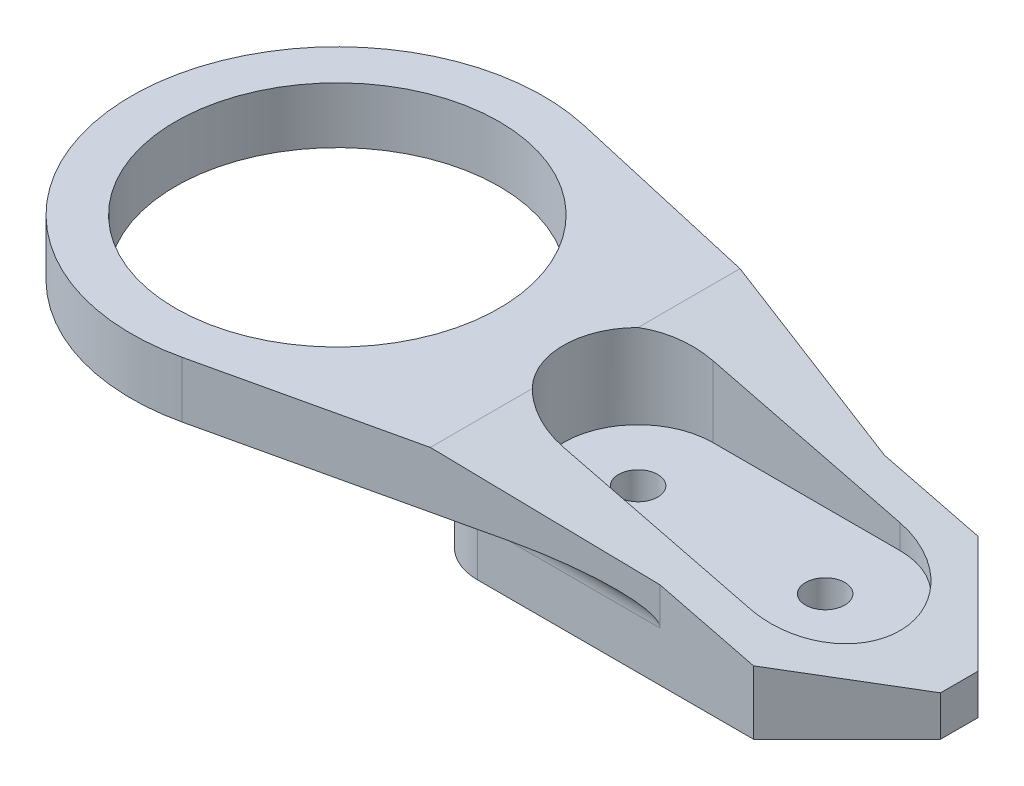
ISO-10303-21;
HEADER;
FILE_DESCRIPTION(('STEP AP214'),'2;1');
FILE_NAME('part.step','',(''),(''),'','','');
FILE_SCHEMA(('AUTOMOTIVE_DESIGN { 1 0 10303 214 1 1 1 1 }'));
ENDSEC;
DATA;
#1=APPLICATION_CONTEXT('core data for automotive mechanical design processes');
#2=APPLICATION_PROTOCOL_DEFINITION('international standard','automotive_design',2000,#1);
#3=PRODUCT_CONTEXT('',#1,'mechanical');
#4=PRODUCT('Part','Part','',(#3));
#5=PRODUCT_RELATED_PRODUCT_CATEGORY('part','',(#4));
#6=PRODUCT_DEFINITION_FORMATION('','',#4);
#7=PRODUCT_DEFINITION_CONTEXT('part definition',#1,'design');
#8=PRODUCT_DEFINITION('design','',#6,#7);
#9=PRODUCT_DEFINITION_SHAPE('','',#8);
#10=(LENGTH_UNIT() NAMED_UNIT(*) SI_UNIT(.MILLI.,.METRE.));
#11=(NAMED_UNIT(*) PLANE_ANGLE_UNIT() SI_UNIT($,.RADIAN.));
#12=(NAMED_UNIT(*) SI_UNIT($,.STERADIAN.) SOLID_ANGLE_UNIT());
#13=UNCERTAINTY_MEASURE_WITH_UNIT(LENGTH_MEASURE(1.E-05),#10,'distance_accuracy_value','');
#14=(GEOMETRIC_REPRESENTATION_CONTEXT(3) GLOBAL_UNCERTAINTY_ASSIGNED_CONTEXT((#13)) GLOBAL_UNIT_ASSIGNED_CONTEXT((#10,
#11,#12)) REPRESENTATION_CONTEXT('',''));
#15=CARTESIAN_POINT('',(0.,0.,0.));
#16=DIRECTION('',(0.,0.,1.));
#17=DIRECTION('',(1.,0.,0.));
#18=AXIS2_PLACEMENT_3D('',#15,#16,#17);
#19=CARTESIAN_POINT('',(17.8298933663439,-2.85,6.));
#20=DIRECTION('',(0.,1.,0.));
#21=DIRECTION('',(0.,0.,1.));
#22=AXIS2_PLACEMENT_3D('',#19,#20,#21);
#23=CYLINDRICAL_SURFACE('',#22,1.05);
#24=CARTESIAN_POINT('',(17.8298933663439,0.,6.));
#25=DIRECTION('',(0.,1.,0.));
#26=DIRECTION('',(-1.,0.,0.));
#27=AXIS2_PLACEMENT_3D('',#24,#25,#26);
#28=CIRCLE('',#27,1.05);
#29=CARTESIAN_POINT('',(16.7798933663439,0.,6.));
#30=VERTEX_POINT('',#29);
#31=EDGE_CURVE('E229',#30,#30,#28,.T.);
#32=ORIENTED_EDGE('',*,*,#31,.F.);
#33=EDGE_LOOP('',(#32));
#34=FACE_BOUND('',#33,.T.);
#35=CARTESIAN_POINT('',(17.8298933663439,2.65,6.));
#36=DIRECTION('',(0.,1.,0.));
#37=DIRECTION('',(0.,0.,1.));
#38=AXIS2_PLACEMENT_3D('',#35,#36,#37);
#39=CIRCLE('',#38,1.05);
#40=CARTESIAN_POINT('',(17.8298933663439,2.65,7.05));
#41=VERTEX_POINT('',#40);
#42=EDGE_CURVE('E226',#41,#41,#39,.F.);
#43=ORIENTED_EDGE('',*,*,#42,.F.);
#44=EDGE_LOOP('',(#43));
#45=FACE_BOUND('',#44,.T.);
#46=ADVANCED_FACE('F41',(#34,#45),#23,.F.);
#47=CARTESIAN_POINT('',(7.82989336634394,-2.85,6.));
#48=DIRECTION('',(0.,1.,0.));
#49=DIRECTION('',(0.,0.,1.));
#50=AXIS2_PLACEMENT_3D('',#47,#48,#49);
#51=CYLINDRICAL_SURFACE('',#50,1.05);
#52=CARTESIAN_POINT('',(7.82989336634394,0.,6.));
#53=DIRECTION('',(0.,1.,0.));
#54=DIRECTION('',(-1.,0.,0.));
#55=AXIS2_PLACEMENT_3D('',#52,#53,#54);
#56=CIRCLE('',#55,1.05);
#57=CARTESIAN_POINT('',(6.77989336634394,0.,6.));
#58=VERTEX_POINT('',#57);
#59=EDGE_CURVE('E232',#58,#58,#56,.T.);
#60=ORIENTED_EDGE('',*,*,#59,.F.);
#61=EDGE_LOOP('',(#60));
#62=FACE_BOUND('',#61,.T.);
#63=CARTESIAN_POINT('',(7.82989336634394,2.65,6.));
#64=DIRECTION('',(0.,1.,0.));
#65=DIRECTION('',(0.,0.,1.));
#66=AXIS2_PLACEMENT_3D('',#63,#64,#65);
#67=CIRCLE('',#66,1.05);
#68=CARTESIAN_POINT('',(7.82989336634394,2.65,7.05));
#69=VERTEX_POINT('',#68);
#70=EDGE_CURVE('E221',#69,#69,#67,.F.);
#71=ORIENTED_EDGE('',*,*,#70,.F.);
#72=EDGE_LOOP('',(#71));
#73=FACE_BOUND('',#72,.T.);
#74=ADVANCED_FACE('F461',(#62,#73),#51,.F.);
#75=CARTESIAN_POINT('',(0.,0.,12.));
#76=DIRECTION('',(0.,0.,-1.));
#77=DIRECTION('',(-1.,0.,0.));
#78=AXIS2_PLACEMENT_3D('',#75,#76,#77);
#79=PLANE('',#78);
#80=DIRECTION('',(0.,1.,0.));
#81=VECTOR('',#80,1.);
#82=CARTESIAN_POINT('',(15.,4.15,12.));
#83=LINE('',#82,#81);
#84=CARTESIAN_POINT('',(15.,2.65,12.));
#85=VERTEX_POINT('',#84);
#86=CARTESIAN_POINT('',(15.,4.64999999999996,12.));
#87=VERTEX_POINT('',#86);
#88=EDGE_CURVE('E261',#85,#87,#83,.T.);
#89=ORIENTED_EDGE('',*,*,#88,.F.);
#90=DIRECTION('',(1.,0.,0.));
#91=VECTOR('',#90,1.);
#92=CARTESIAN_POINT('',(5.25,2.65,12.));
#93=LINE('',#92,#91);
#94=CARTESIAN_POINT('',(5.25,2.65,12.));
#95=VERTEX_POINT('',#94);
#96=EDGE_CURVE('E345',#85,#95,#93,.F.);
#97=ORIENTED_EDGE('',*,*,#96,.T.);
#98=DIRECTION('',(0.,1.,0.));
#99=VECTOR('',#98,1.);
#100=CARTESIAN_POINT('',(5.25,0.,12.));
#101=LINE('',#100,#99);
#102=CARTESIAN_POINT('',(5.25,0.,12.));
#103=VERTEX_POINT('',#102);
#104=EDGE_CURVE('E326',#95,#103,#101,.F.);
#105=ORIENTED_EDGE('',*,*,#104,.T.);
#106=DIRECTION('',(1.,0.,0.));
#107=VECTOR('',#106,1.);
#108=CARTESIAN_POINT('',(25.,0.,12.));
#109=LINE('',#108,#107);
#110=CARTESIAN_POINT('',(20.,0.,12.));
#111=VERTEX_POINT('',#110);
#112=EDGE_CURVE('E269',#103,#111,#109,.T.);
#113=ORIENTED_EDGE('',*,*,#112,.T.);
#114=DIRECTION('',(0.,1.,0.));
#115=VECTOR('',#114,1.);
#116=CARTESIAN_POINT('',(20.,0.,12.));
#117=LINE('',#116,#115);
#118=CARTESIAN_POINT('',(20.,3.39999999999998,12.));
#119=VERTEX_POINT('',#118);
#120=EDGE_CURVE('E291',#111,#119,#117,.T.);
#121=ORIENTED_EDGE('',*,*,#120,.T.);
#122=DIRECTION('',(0.970142500145333,-0.24253562503633,0.));
#123=VECTOR('',#122,1.);
#124=CARTESIAN_POINT('',(4.99999999999971,7.15,12.));
#125=LINE('',#124,#123);
#126=EDGE_CURVE('E287',#119,#87,#125,.F.);
#127=ORIENTED_EDGE('',*,*,#126,.T.);
#128=EDGE_LOOP('',(#89,#97,#105,#113,#121,#127));
#129=FACE_BOUND('',#128,.T.);
#130=ADVANCED_FACE('F442',(#129),#79,.F.);
#131=CARTESIAN_POINT('',(25.,0.,12.));
#132=DIRECTION('',(0.,1.,0.));
#133=DIRECTION('',(-1.,0.,0.));
#134=AXIS2_PLACEMENT_3D('',#131,#132,#133);
#135=PLANE('',#134);
#136=ORIENTED_EDGE('',*,*,#59,.T.);
#137=EDGE_LOOP('',(#136));
#138=FACE_BOUND('',#137,.T.);
#139=ORIENTED_EDGE('',*,*,#31,.T.);
#140=EDGE_LOOP('',(#139));
#141=FACE_BOUND('',#140,.T.);
#142=ORIENTED_EDGE('',*,*,#112,.F.);
#143=CARTESIAN_POINT('',(5.25,0.,9.));
#144=DIRECTION('',(0.,1.,0.));
#145=DIRECTION('',(-1.,0.,0.));
#146=AXIS2_PLACEMENT_3D('',#143,#144,#145);
#147=CIRCLE('',#146,3.);
#148=CARTESIAN_POINT('',(2.25,0.,9.));
#149=VERTEX_POINT('',#148);
#150=EDGE_CURVE('E330',#103,#149,#147,.F.);
#151=ORIENTED_EDGE('',*,*,#150,.T.);
#152=DIRECTION('',(0.,0.,1.));
#153=VECTOR('',#152,1.);
#154=CARTESIAN_POINT('',(2.25,0.,12.));
#155=LINE('',#154,#153);
#156=CARTESIAN_POINT('',(2.25,0.,3.));
#157=VERTEX_POINT('',#156);
#158=EDGE_CURVE('E241',#157,#149,#155,.T.);
#159=ORIENTED_EDGE('',*,*,#158,.F.);
#160=CARTESIAN_POINT('',(5.25,0.,3.));
#161=DIRECTION('',(0.,1.,0.));
#162=DIRECTION('',(-1.,0.,0.));
#163=AXIS2_PLACEMENT_3D('',#160,#161,#162);
#164=CIRCLE('',#163,3.);
#165=CARTESIAN_POINT('',(5.25,0.,0.));
#166=VERTEX_POINT('',#165);
#167=EDGE_CURVE('E328',#157,#166,#164,.F.);
#168=ORIENTED_EDGE('',*,*,#167,.T.);
#169=DIRECTION('',(1.,0.,0.));
#170=VECTOR('',#169,1.);
#171=CARTESIAN_POINT('',(25.,0.,0.));
#172=LINE('',#171,#170);
#173=CARTESIAN_POINT('',(20.,0.,0.));
#174=VERTEX_POINT('',#173);
#175=EDGE_CURVE('E260',#166,#174,#172,.T.);
#176=ORIENTED_EDGE('',*,*,#175,.T.);
#177=DIRECTION('',(0.707106781186549,0.,0.707106781186547));
#178=VECTOR('',#177,1.);
#179=CARTESIAN_POINT('',(25.,0.,5.00000000000001));
#180=LINE('',#179,#178);
#181=CARTESIAN_POINT('',(25.,0.,5.00000000000001));
#182=VERTEX_POINT('',#181);
#183=EDGE_CURVE('E303',#174,#182,#180,.T.);
#184=ORIENTED_EDGE('',*,*,#183,.T.);
#185=DIRECTION('',(0.,0.,-1.));
#186=VECTOR('',#185,1.);
#187=CARTESIAN_POINT('',(25.,0.,12.));
#188=LINE('',#187,#186);
#189=CARTESIAN_POINT('',(25.,0.,6.99999999999997));
#190=VERTEX_POINT('',#189);
#191=EDGE_CURVE('E271',#190,#182,#188,.T.);
#192=ORIENTED_EDGE('',*,*,#191,.F.);
#193=DIRECTION('',(0.707106781186547,0.,-0.707106781186549));
#194=VECTOR('',#193,1.);
#195=CARTESIAN_POINT('',(20.,0.,12.));
#196=LINE('',#195,#194);
#197=EDGE_CURVE('E305',#190,#111,#196,.F.);
#198=ORIENTED_EDGE('',*,*,#197,.T.);
#199=EDGE_LOOP('',(#142,#151,#159,#168,#176,#184,#192,#198));
#200=FACE_BOUND('',#199,.T.);
#201=ADVANCED_FACE('F385',(#138,#141,#200),#135,.F.);
#202=CARTESIAN_POINT('',(0.,0.,0.));
#203=DIRECTION('',(0.,0.,-1.));
#204=DIRECTION('',(-1.,0.,0.));
#205=AXIS2_PLACEMENT_3D('',#202,#203,#204);
#206=PLANE('',#205);
#207=DIRECTION('',(0.,1.,0.));
#208=VECTOR('',#207,1.);
#209=CARTESIAN_POINT('',(5.25,0.,0.));
#210=LINE('',#209,#208);
#211=CARTESIAN_POINT('',(5.25,2.65,0.));
#212=VERTEX_POINT('',#211);
#213=EDGE_CURVE('E332',#166,#212,#210,.T.);
#214=ORIENTED_EDGE('',*,*,#213,.T.);
#215=DIRECTION('',(-1.,0.,0.));
#216=VECTOR('',#215,1.);
#217=CARTESIAN_POINT('',(0.,2.65,0.));
#218=LINE('',#217,#216);
#219=CARTESIAN_POINT('',(15.,2.65,0.));
#220=VERTEX_POINT('',#219);
#221=EDGE_CURVE('E352',#212,#220,#218,.F.);
#222=ORIENTED_EDGE('',*,*,#221,.T.);
#223=DIRECTION('',(0.,1.,0.));
#224=VECTOR('',#223,1.);
#225=CARTESIAN_POINT('',(15.,4.15,0.));
#226=LINE('',#225,#224);
#227=CARTESIAN_POINT('',(15.,4.64999999999996,0.));
#228=VERTEX_POINT('',#227);
#229=EDGE_CURVE('E57',#220,#228,#226,.T.);
#230=ORIENTED_EDGE('',*,*,#229,.T.);
#231=DIRECTION('',(-0.970142500145333,0.24253562503633,0.));
#232=VECTOR('',#231,1.);
#233=CARTESIAN_POINT('',(1.97647058823525,7.9058823529411,0.));
#234=LINE('',#233,#232);
#235=CARTESIAN_POINT('',(20.,3.39999999999998,0.));
#236=VERTEX_POINT('',#235);
#237=EDGE_CURVE('E281',#228,#236,#234,.F.);
#238=ORIENTED_EDGE('',*,*,#237,.T.);
#239=DIRECTION('',(0.,-1.,0.));
#240=VECTOR('',#239,1.);
#241=CARTESIAN_POINT('',(20.,0.,0.));
#242=LINE('',#241,#240);
#243=EDGE_CURVE('E308',#236,#174,#242,.T.);
#244=ORIENTED_EDGE('',*,*,#243,.T.);
#245=ORIENTED_EDGE('',*,*,#175,.F.);
#246=EDGE_LOOP('',(#214,#222,#230,#238,#244,#245));
#247=FACE_BOUND('',#246,.T.);
#248=ADVANCED_FACE('F377',(#247),#206,.T.);
#249=CARTESIAN_POINT('',(25.,7.15,12.));
#250=DIRECTION('',(-1.,0.,0.));
#251=DIRECTION('',(0.,0.,1.));
#252=AXIS2_PLACEMENT_3D('',#249,#250,#251);
#253=PLANE('',#252);
#254=DIRECTION('',(0.,0.,1.));
#255=VECTOR('',#254,1.);
#256=CARTESIAN_POINT('',(25.,2.14999999999999,12.));
#257=LINE('',#256,#255);
#258=CARTESIAN_POINT('',(25.,2.14999999999999,5.00000000000001));
#259=VERTEX_POINT('',#258);
#260=CARTESIAN_POINT('',(25.,2.14999999999999,6.99999999999997));
#261=VERTEX_POINT('',#260);
#262=EDGE_CURVE('E284',#259,#261,#257,.T.);
#263=ORIENTED_EDGE('',*,*,#262,.T.);
#264=DIRECTION('',(0.,-1.,0.));
#265=VECTOR('',#264,1.);
#266=CARTESIAN_POINT('',(25.,7.15,6.99999999999997));
#267=LINE('',#266,#265);
#268=EDGE_CURVE('E301',#261,#190,#267,.T.);
#269=ORIENTED_EDGE('',*,*,#268,.T.);
#270=ORIENTED_EDGE('',*,*,#191,.T.);
#271=DIRECTION('',(0.,1.,0.));
#272=VECTOR('',#271,1.);
#273=CARTESIAN_POINT('',(25.,2.14999999999999,5.00000000000001));
#274=LINE('',#273,#272);
#275=EDGE_CURVE('E298',#182,#259,#274,.T.);
#276=ORIENTED_EDGE('',*,*,#275,.T.);
#277=EDGE_LOOP('',(#263,#269,#270,#276));
#278=FACE_BOUND('',#277,.T.);
#279=ADVANCED_FACE('F436',(#278),#253,.F.);
#280=CARTESIAN_POINT('',(0.,7.15,12.));
#281=DIRECTION('',(0.,-1.,0.));
#282=DIRECTION('',(0.,0.,-1.));
#283=AXIS2_PLACEMENT_3D('',#280,#281,#282);
#284=PLANE('',#283);
#285=CARTESIAN_POINT('',(-8.25,7.15,6.));
#286=DIRECTION('',(0.,-1.,0.));
#287=DIRECTION('',(0.,0.,-1.));
#288=AXIS2_PLACEMENT_3D('',#285,#286,#287);
#289=CIRCLE('',#288,8.65);
#290=CARTESIAN_POINT('',(-8.25,7.15,-2.65));
#291=VERTEX_POINT('',#290);
#292=EDGE_CURVE('E238',#291,#291,#289,.T.);
#293=ORIENTED_EDGE('',*,*,#292,.T.);
#294=EDGE_LOOP('',(#293));
#295=FACE_BOUND('',#294,.T.);
#296=DIRECTION('',(0.,0.,-1.));
#297=VECTOR('',#296,1.);
#298=CARTESIAN_POINT('',(4.99999999999971,7.15,12.));
#299=LINE('',#298,#297);
#300=CARTESIAN_POINT('',(4.99999999999971,7.15,14.2771102196746));
#301=VERTEX_POINT('',#300);
#302=CARTESIAN_POINT('',(4.99999999999971,7.15,8.82696012266195));
#303=VERTEX_POINT('',#302);
#304=EDGE_CURVE('E276',#301,#303,#299,.T.);
#305=ORIENTED_EDGE('',*,*,#304,.T.);
#306=CARTESIAN_POINT('',(7.82989336634394,7.15,6.));
#307=DIRECTION('',(0.,1.,0.));
#308=DIRECTION('',(0.,0.,1.));
#309=AXIS2_PLACEMENT_3D('',#306,#307,#308);
#310=CIRCLE('',#309,4.);
#311=CARTESIAN_POINT('',(4.99999999999971,7.15,3.17303987733804));
#312=VERTEX_POINT('',#311);
#313=EDGE_CURVE('E213',#312,#303,#310,.T.);
#314=ORIENTED_EDGE('',*,*,#313,.F.);
#315=CARTESIAN_POINT('',(4.99999999999971,7.15,-2.27711021967455));
#316=VERTEX_POINT('',#315);
#317=EDGE_CURVE('E275',#312,#316,#299,.T.);
#318=ORIENTED_EDGE('',*,*,#317,.T.);
#319=DIRECTION('',(-0.975040415413256,0.,-0.222027449453318));
#320=VECTOR('',#319,1.);
#321=CARTESIAN_POINT('',(0.739442824661187,7.15,-3.24728604822164));
#322=LINE('',#321,#320);
#323=CARTESIAN_POINT('',(-5.80494920248651,7.15,-4.73751624487906));
#324=VERTEX_POINT('',#323);
#325=EDGE_CURVE('E244',#316,#324,#322,.T.);
#326=ORIENTED_EDGE('',*,*,#325,.T.);
#327=CARTESIAN_POINT('',(-8.25,7.15,6.));
#328=DIRECTION('',(0.,1.,0.));
#329=DIRECTION('',(0.,0.,1.));
#330=AXIS2_PLACEMENT_3D('',#327,#328,#329);
#331=CIRCLE('',#330,11.0123806922692);
#332=CARTESIAN_POINT('',(-5.80494920248651,7.15,16.7375162448791));
#333=VERTEX_POINT('',#332);
#334=EDGE_CURVE('E255',#324,#333,#331,.T.);
#335=ORIENTED_EDGE('',*,*,#334,.T.);
#336=DIRECTION('',(-0.975040415413256,0.,0.222027449453318));
#337=VECTOR('',#336,1.);
#338=CARTESIAN_POINT('',(3.3372716632385,7.15,14.6557317884927));
#339=LINE('',#338,#337);
#340=EDGE_CURVE('E248',#301,#333,#339,.T.);
#341=ORIENTED_EDGE('',*,*,#340,.F.);
#342=EDGE_LOOP('',(#305,#314,#318,#326,#335,#341));
#343=FACE_BOUND('',#342,.T.);
#344=ADVANCED_FACE('F419',(#295,#343),#284,.F.);
#345=CARTESIAN_POINT('',(0.739442824661187,4.15,-3.24728604822164));
#346=DIRECTION('',(0.222027449453318,0.,-0.975040415413256));
#347=DIRECTION('',(-0.975040415413256,0.,-0.222027449453318));
#348=AXIS2_PLACEMENT_3D('',#345,#346,#347);
#349=PLANE('',#348);
#350=ORIENTED_EDGE('',*,*,#325,.F.);
#351=DIRECTION('',(-0.947302626103098,0.236825656525771,-0.215711249102385));
#352=VECTOR('',#351,1.);
#353=CARTESIAN_POINT('',(1.65143880185032,7.98714029953734,-3.0396145122257));
#354=LINE('',#353,#352);
#355=EDGE_CURVE('E279',#316,#228,#354,.F.);
#356=ORIENTED_EDGE('',*,*,#355,.T.);
#357=ORIENTED_EDGE('',*,*,#229,.F.);
#358=CARTESIAN_POINT('',(8.41270357912484,2.65,-1.5));
#359=DIRECTION('',(0.222027449453318,0.,-0.975040415413256));
#360=DIRECTION('',(-0.975040415413256,0.,-0.222027449453318));
#361=AXIS2_PLACEMENT_3D('',#358,#359,#360);
#362=ELLIPSE('',#361,6.75592141284034,1.5);
#363=CARTESIAN_POINT('',(8.41270357912484,4.15,-1.5));
#364=VERTEX_POINT('',#363);
#365=EDGE_CURVE('E11',#220,#364,#362,.F.);
#366=ORIENTED_EDGE('',*,*,#365,.T.);
#367=DIRECTION('',(-0.975040415413256,0.,-0.222027449453318));
#368=VECTOR('',#367,1.);
#369=CARTESIAN_POINT('',(0.739442824661187,4.15,-3.24728604822164));
#370=LINE('',#369,#368);
#371=CARTESIAN_POINT('',(-5.80494920248651,4.15,-4.73751624487906));
#372=VERTEX_POINT('',#371);
#373=EDGE_CURVE('E245',#364,#372,#370,.T.);
#374=ORIENTED_EDGE('',*,*,#373,.T.);
#375=DIRECTION('',(0.,1.,0.));
#376=VECTOR('',#375,1.);
#377=CARTESIAN_POINT('',(-5.80494920248651,4.15,-4.73751624487906));
#378=LINE('',#377,#376);
#379=EDGE_CURVE('E253',#372,#324,#378,.T.);
#380=ORIENTED_EDGE('',*,*,#379,.T.);
#381=EDGE_LOOP('',(#350,#356,#357,#366,#374,#380));
#382=FACE_BOUND('',#381,.T.);
#383=ADVANCED_FACE('F417',(#382),#349,.T.);
#384=CARTESIAN_POINT('',(3.3372716632385,4.15,14.6557317884927));
#385=DIRECTION('',(-0.222027449453318,0.,-0.975040415413256));
#386=DIRECTION('',(-0.975040415413256,0.,0.222027449453318));
#387=AXIS2_PLACEMENT_3D('',#384,#385,#386);
#388=PLANE('',#387);
#389=ORIENTED_EDGE('',*,*,#88,.T.);
#390=DIRECTION('',(0.947302626103098,-0.236825656525771,-0.215711249102385));
#391=VECTOR('',#390,1.);
#392=CARTESIAN_POINT('',(5.46531342989284,7.03367164252672,14.1711532230184));
#393=LINE('',#392,#391);
#394=EDGE_CURVE('E289',#87,#301,#393,.F.);
#395=ORIENTED_EDGE('',*,*,#394,.T.);
#396=ORIENTED_EDGE('',*,*,#340,.T.);
#397=DIRECTION('',(0.,1.,0.));
#398=VECTOR('',#397,1.);
#399=CARTESIAN_POINT('',(-5.80494920248651,4.15,16.7375162448791));
#400=LINE('',#399,#398);
#401=CARTESIAN_POINT('',(-5.80494920248651,4.15,16.7375162448791));
#402=VERTEX_POINT('',#401);
#403=EDGE_CURVE('E264',#402,#333,#400,.T.);
#404=ORIENTED_EDGE('',*,*,#403,.F.);
#405=DIRECTION('',(-0.975040415413256,0.,0.222027449453318));
#406=VECTOR('',#405,1.);
#407=CARTESIAN_POINT('',(3.3372716632385,4.15,14.6557317884927));
#408=LINE('',#407,#406);
#409=CARTESIAN_POINT('',(8.41270357912485,4.15,13.5));
#410=VERTEX_POINT('',#409);
#411=EDGE_CURVE('E251',#410,#402,#408,.T.);
#412=ORIENTED_EDGE('',*,*,#411,.F.);
#413=CARTESIAN_POINT('',(8.41270357912485,2.65,13.5));
#414=DIRECTION('',(-0.222027449453318,0.,-0.975040415413256));
#415=DIRECTION('',(-0.975040415413256,0.,0.222027449453318));
#416=AXIS2_PLACEMENT_3D('',#413,#414,#415);
#417=ELLIPSE('',#416,6.75592141284034,1.5);
#418=EDGE_CURVE('E50',#410,#85,#417,.T.);
#419=ORIENTED_EDGE('',*,*,#418,.T.);
#420=EDGE_LOOP('',(#389,#395,#396,#404,#412,#419));
#421=FACE_BOUND('',#420,.T.);
#422=ADVANCED_FACE('F409',(#421),#388,.F.);
#423=CARTESIAN_POINT('',(-8.25,4.15,6.));
#424=DIRECTION('',(0.,1.,0.));
#425=DIRECTION('',(0.,0.,1.));
#426=AXIS2_PLACEMENT_3D('',#423,#424,#425);
#427=CYLINDRICAL_SURFACE('',#426,11.0123806922692);
#428=ORIENTED_EDGE('',*,*,#334,.F.);
#429=ORIENTED_EDGE('',*,*,#379,.F.);
#430=CARTESIAN_POINT('',(-8.25,4.15,6.));
#431=DIRECTION('',(0.,1.,0.));
#432=DIRECTION('',(0.,0.,1.));
#433=AXIS2_PLACEMENT_3D('',#430,#431,#432);
#434=CIRCLE('',#433,11.0123806922692);
#435=EDGE_CURVE('E247',#372,#402,#434,.T.);
#436=ORIENTED_EDGE('',*,*,#435,.T.);
#437=ORIENTED_EDGE('',*,*,#403,.T.);
#438=EDGE_LOOP('',(#428,#429,#436,#437));
#439=FACE_BOUND('',#438,.T.);
#440=ADVANCED_FACE('F414',(#439),#427,.T.);
#441=CARTESIAN_POINT('',(0.,4.15,0.));
#442=DIRECTION('',(0.,1.,0.));
#443=DIRECTION('',(0.,0.,1.));
#444=AXIS2_PLACEMENT_3D('',#441,#442,#443);
#445=PLANE('',#444);
#446=CARTESIAN_POINT('',(-8.25,4.15,6.));
#447=DIRECTION('',(0.,-1.,0.));
#448=DIRECTION('',(0.,0.,-1.));
#449=AXIS2_PLACEMENT_3D('',#446,#447,#448);
#450=CIRCLE('',#449,8.65);
#451=CARTESIAN_POINT('',(-8.25,4.15,-2.65));
#452=VERTEX_POINT('',#451);
#453=EDGE_CURVE('E235',#452,#452,#450,.T.);
#454=ORIENTED_EDGE('',*,*,#453,.F.);
#455=EDGE_LOOP('',(#454));
#456=FACE_BOUND('',#455,.T.);
#457=CARTESIAN_POINT('',(5.25,4.15,9.));
#458=DIRECTION('',(0.,1.,0.));
#459=DIRECTION('',(0.,0.,1.));
#460=AXIS2_PLACEMENT_3D('',#457,#458,#459);
#461=CIRCLE('',#460,4.5);
#462=CARTESIAN_POINT('',(0.75,4.15,9.));
#463=VERTEX_POINT('',#462);
#464=CARTESIAN_POINT('',(5.25,4.15,13.5));
#465=VERTEX_POINT('',#464);
#466=EDGE_CURVE('E340',#463,#465,#461,.T.);
#467=ORIENTED_EDGE('',*,*,#466,.T.);
#468=DIRECTION('',(1.,0.,0.));
#469=VECTOR('',#468,1.);
#470=CARTESIAN_POINT('',(15.,4.15,13.5));
#471=LINE('',#470,#469);
#472=EDGE_CURVE('E342',#465,#410,#471,.T.);
#473=ORIENTED_EDGE('',*,*,#472,.T.);
#474=ORIENTED_EDGE('',*,*,#411,.T.);
#475=ORIENTED_EDGE('',*,*,#435,.F.);
#476=ORIENTED_EDGE('',*,*,#373,.F.);
#477=DIRECTION('',(-1.,0.,0.));
#478=VECTOR('',#477,1.);
#479=CARTESIAN_POINT('',(0.,4.15,-1.5));
#480=LINE('',#479,#478);
#481=CARTESIAN_POINT('',(5.25,4.15,-1.5));
#482=VERTEX_POINT('',#481);
#483=EDGE_CURVE('E334',#364,#482,#480,.T.);
#484=ORIENTED_EDGE('',*,*,#483,.T.);
#485=CARTESIAN_POINT('',(5.25,4.15,3.));
#486=DIRECTION('',(0.,1.,0.));
#487=DIRECTION('',(0.,0.,1.));
#488=AXIS2_PLACEMENT_3D('',#485,#486,#487);
#489=CIRCLE('',#488,4.5);
#490=CARTESIAN_POINT('',(0.75,4.15,3.));
#491=VERTEX_POINT('',#490);
#492=EDGE_CURVE('E336',#482,#491,#489,.T.);
#493=ORIENTED_EDGE('',*,*,#492,.T.);
#494=DIRECTION('',(0.,0.,1.));
#495=VECTOR('',#494,1.);
#496=CARTESIAN_POINT('',(0.75,4.15,0.));
#497=LINE('',#496,#495);
#498=EDGE_CURVE('E338',#491,#463,#497,.T.);
#499=ORIENTED_EDGE('',*,*,#498,.T.);
#500=EDGE_LOOP('',(#467,#473,#474,#475,#476,#484,#493,#499));
#501=FACE_BOUND('',#500,.T.);
#502=ADVANCED_FACE('F405',(#456,#501),#445,.F.);
#503=CARTESIAN_POINT('',(2.25,-16.85,6.));
#504=DIRECTION('',(-1.,0.,0.));
#505=DIRECTION('',(0.,0.,1.));
#506=AXIS2_PLACEMENT_3D('',#503,#504,#505);
#507=PLANE('',#506);
#508=DIRECTION('',(0.,1.,0.));
#509=VECTOR('',#508,1.);
#510=CARTESIAN_POINT('',(2.25,4.15,9.));
#511=LINE('',#510,#509);
#512=CARTESIAN_POINT('',(2.25,2.65,9.));
#513=VERTEX_POINT('',#512);
#514=EDGE_CURVE('E323',#149,#513,#511,.T.);
#515=ORIENTED_EDGE('',*,*,#514,.T.);
#516=DIRECTION('',(0.,0.,1.));
#517=VECTOR('',#516,1.);
#518=CARTESIAN_POINT('',(2.25,2.65,6.));
#519=LINE('',#518,#517);
#520=CARTESIAN_POINT('',(2.25,2.65,3.));
#521=VERTEX_POINT('',#520);
#522=EDGE_CURVE('E349',#513,#521,#519,.F.);
#523=ORIENTED_EDGE('',*,*,#522,.T.);
#524=DIRECTION('',(0.,1.,0.));
#525=VECTOR('',#524,1.);
#526=CARTESIAN_POINT('',(2.25,-16.85,3.));
#527=LINE('',#526,#525);
#528=EDGE_CURVE('E321',#521,#157,#527,.F.);
#529=ORIENTED_EDGE('',*,*,#528,.T.);
#530=ORIENTED_EDGE('',*,*,#158,.T.);
#531=EDGE_LOOP('',(#515,#523,#529,#530));
#532=FACE_BOUND('',#531,.T.);
#533=ADVANCED_FACE('F389',(#532),#507,.T.);
#534=CARTESIAN_POINT('',(-8.25,14.15,6.));
#535=DIRECTION('',(0.,-1.,0.));
#536=DIRECTION('',(0.,0.,-1.));
#537=AXIS2_PLACEMENT_3D('',#534,#535,#536);
#538=CYLINDRICAL_SURFACE('',#537,8.65);
#539=ORIENTED_EDGE('',*,*,#453,.T.);
#540=EDGE_LOOP('',(#539));
#541=FACE_BOUND('',#540,.T.);
#542=ORIENTED_EDGE('',*,*,#292,.F.);
#543=EDGE_LOOP('',(#542));
#544=FACE_BOUND('',#543,.T.);
#545=ADVANCED_FACE('F472',(#541,#544),#538,.F.);
#546=CARTESIAN_POINT('',(4.99999999999971,7.15,12.));
#547=DIRECTION('',(-0.24253562503633,-0.970142500145333,0.));
#548=DIRECTION('',(0.,0.,-1.));
#549=AXIS2_PLACEMENT_3D('',#546,#547,#548);
#550=PLANE('',#549);
#551=CARTESIAN_POINT('',(7.82989336634394,6.44252665841395,6.));
#552=DIRECTION('',(-0.24253562503633,-0.970142500145333,0.));
#553=DIRECTION('',(-0.970142500145333,0.24253562503633,0.));
#554=AXIS2_PLACEMENT_3D('',#551,#552,#553);
#555=ELLIPSE('',#554,4.12310562561766,4.);
#556=CARTESIAN_POINT('',(7.82989336634394,6.44252665841395,10.));
#557=VERTEX_POINT('',#556);
#558=EDGE_CURVE('E195',#303,#557,#555,.F.);
#559=ORIENTED_EDGE('',*,*,#558,.F.);
#560=ORIENTED_EDGE('',*,*,#304,.F.);
#561=ORIENTED_EDGE('',*,*,#394,.F.);
#562=ORIENTED_EDGE('',*,*,#126,.F.);
#563=DIRECTION('',(0.696310623822791,-0.174077655955695,-0.696310623822793));
#564=VECTOR('',#563,1.);
#565=CARTESIAN_POINT('',(12.2727272727271,5.33181818181817,19.7272727272729));
#566=LINE('',#565,#564);
#567=EDGE_CURVE('E296',#119,#261,#566,.T.);
#568=ORIENTED_EDGE('',*,*,#567,.T.);
#569=ORIENTED_EDGE('',*,*,#262,.F.);
#570=DIRECTION('',(0.696310623822793,-0.174077655955696,0.696310623822791));
#571=VECTOR('',#570,1.);
#572=CARTESIAN_POINT('',(18.0909090909089,3.87727272727274,-1.90909090909105));
#573=LINE('',#572,#571);
#574=EDGE_CURVE('E294',#259,#236,#573,.F.);
#575=ORIENTED_EDGE('',*,*,#574,.T.);
#576=ORIENTED_EDGE('',*,*,#237,.F.);
#577=ORIENTED_EDGE('',*,*,#355,.F.);
#578=ORIENTED_EDGE('',*,*,#317,.F.);
#579=CARTESIAN_POINT('',(7.82989336634394,6.44252665841395,2.));
#580=VERTEX_POINT('',#579);
#581=EDGE_CURVE('E319',#580,#312,#555,.F.);
#582=ORIENTED_EDGE('',*,*,#581,.F.);
#583=DIRECTION('',(0.970142500145333,-0.24253562503633,0.));
#584=VECTOR('',#583,1.);
#585=CARTESIAN_POINT('',(4.99999999999971,7.15,2.));
#586=LINE('',#585,#584);
#587=CARTESIAN_POINT('',(17.8298933663439,3.94252665841398,2.));
#588=VERTEX_POINT('',#587);
#589=EDGE_CURVE('E317',#588,#580,#586,.F.);
#590=ORIENTED_EDGE('',*,*,#589,.F.);
#591=CARTESIAN_POINT('',(17.8298933663439,3.94252665841398,6.));
#592=DIRECTION('',(-0.24253562503633,-0.970142500145333,0.));
#593=DIRECTION('',(-0.970142500145333,0.24253562503633,0.));
#594=AXIS2_PLACEMENT_3D('',#591,#592,#593);
#595=ELLIPSE('',#594,4.12310562561766,4.);
#596=CARTESIAN_POINT('',(17.8298933663439,3.94252665841398,10.));
#597=VERTEX_POINT('',#596);
#598=EDGE_CURVE('E315',#597,#588,#595,.F.);
#599=ORIENTED_EDGE('',*,*,#598,.F.);
#600=DIRECTION('',(-0.970142500145333,0.24253562503633,0.));
#601=VECTOR('',#600,1.);
#602=CARTESIAN_POINT('',(4.99999999999971,7.15,10.));
#603=LINE('',#602,#601);
#604=EDGE_CURVE('E311',#557,#597,#603,.F.);
#605=ORIENTED_EDGE('',*,*,#604,.F.);
#606=EDGE_LOOP('',(#559,#560,#561,#562,#568,#569,#575,#576,#577,#578,#582,#590,#599,#605));
#607=FACE_BOUND('',#606,.T.);
#608=ADVANCED_FACE('F426',(#607),#550,.F.);
#609=CARTESIAN_POINT('',(20.,0.,12.));
#610=DIRECTION('',(-0.707106781186549,0.,-0.707106781186547));
#611=DIRECTION('',(0.,1.,0.));
#612=AXIS2_PLACEMENT_3D('',#609,#610,#611);
#613=PLANE('',#612);
#614=ORIENTED_EDGE('',*,*,#197,.F.);
#615=ORIENTED_EDGE('',*,*,#268,.F.);
#616=ORIENTED_EDGE('',*,*,#567,.F.);
#617=ORIENTED_EDGE('',*,*,#120,.F.);
#618=EDGE_LOOP('',(#614,#615,#616,#617));
#619=FACE_BOUND('',#618,.T.);
#620=ADVANCED_FACE('F439',(#619),#613,.F.);
#621=CARTESIAN_POINT('',(25.,7.15,5.00000000000001));
#622=DIRECTION('',(0.707106781186547,0.,-0.707106781186549));
#623=DIRECTION('',(0.,-1.,0.));
#624=AXIS2_PLACEMENT_3D('',#621,#622,#623);
#625=PLANE('',#624);
#626=ORIENTED_EDGE('',*,*,#183,.F.);
#627=ORIENTED_EDGE('',*,*,#243,.F.);
#628=ORIENTED_EDGE('',*,*,#574,.F.);
#629=ORIENTED_EDGE('',*,*,#275,.F.);
#630=EDGE_LOOP('',(#626,#627,#628,#629));
#631=FACE_BOUND('',#630,.T.);
#632=ADVANCED_FACE('F431',(#631),#625,.T.);
#633=CARTESIAN_POINT('',(7.82989336634394,2.65,6.));
#634=DIRECTION('',(0.,1.,0.));
#635=DIRECTION('',(0.,0.,1.));
#636=AXIS2_PLACEMENT_3D('',#633,#634,#635);
#637=PLANE('',#636);
#638=CARTESIAN_POINT('',(7.82989336634394,2.65,6.));
#639=DIRECTION('',(0.,1.,0.));
#640=DIRECTION('',(0.,0.,1.));
#641=AXIS2_PLACEMENT_3D('',#638,#639,#640);
#642=CIRCLE('',#641,4.);
#643=CARTESIAN_POINT('',(7.82989336634394,2.65,2.));
#644=VERTEX_POINT('',#643);
#645=CARTESIAN_POINT('',(7.82989336634394,2.65,10.));
#646=VERTEX_POINT('',#645);
#647=EDGE_CURVE('E192',#644,#646,#642,.T.);
#648=ORIENTED_EDGE('',*,*,#647,.T.);
#649=DIRECTION('',(1.,0.,0.));
#650=VECTOR('',#649,1.);
#651=CARTESIAN_POINT('',(17.8298933663439,2.65,10.));
#652=LINE('',#651,#650);
#653=CARTESIAN_POINT('',(17.8298933663439,2.65,10.));
#654=VERTEX_POINT('',#653);
#655=EDGE_CURVE('E202',#646,#654,#652,.T.);
#656=ORIENTED_EDGE('',*,*,#655,.T.);
#657=CARTESIAN_POINT('',(17.8298933663439,2.65,6.));
#658=DIRECTION('',(0.,1.,0.));
#659=DIRECTION('',(0.,0.,1.));
#660=AXIS2_PLACEMENT_3D('',#657,#658,#659);
#661=CIRCLE('',#660,4.);
#662=CARTESIAN_POINT('',(17.8298933663439,2.65,2.));
#663=VERTEX_POINT('',#662);
#664=EDGE_CURVE('E208',#654,#663,#661,.T.);
#665=ORIENTED_EDGE('',*,*,#664,.T.);
#666=DIRECTION('',(-1.,0.,0.));
#667=VECTOR('',#666,1.);
#668=CARTESIAN_POINT('',(7.82989336634394,2.65,2.));
#669=LINE('',#668,#667);
#670=EDGE_CURVE('E199',#663,#644,#669,.T.);
#671=ORIENTED_EDGE('',*,*,#670,.T.);
#672=EDGE_LOOP('',(#648,#656,#665,#671));
#673=FACE_BOUND('',#672,.T.);
#674=ORIENTED_EDGE('',*,*,#70,.T.);
#675=EDGE_LOOP('',(#674));
#676=FACE_BOUND('',#675,.T.);
#677=ORIENTED_EDGE('',*,*,#42,.T.);
#678=EDGE_LOOP('',(#677));
#679=FACE_BOUND('',#678,.T.);
#680=ADVANCED_FACE('F210',(#673,#676,#679),#637,.T.);
#681=CARTESIAN_POINT('',(7.82989336634394,2.65,6.));
#682=DIRECTION('',(0.,1.,0.));
#683=DIRECTION('',(0.,0.,1.));
#684=AXIS2_PLACEMENT_3D('',#681,#682,#683);
#685=CYLINDRICAL_SURFACE('',#684,4.);
#686=ORIENTED_EDGE('',*,*,#558,.T.);
#687=DIRECTION('',(0.,1.,0.));
#688=VECTOR('',#687,1.);
#689=CARTESIAN_POINT('',(7.82989336634394,2.65,10.));
#690=LINE('',#689,#688);
#691=EDGE_CURVE('E187',#646,#557,#690,.T.);
#692=ORIENTED_EDGE('',*,*,#691,.F.);
#693=ORIENTED_EDGE('',*,*,#647,.F.);
#694=DIRECTION('',(0.,1.,0.));
#695=VECTOR('',#694,1.);
#696=CARTESIAN_POINT('',(7.82989336634394,2.65,2.));
#697=LINE('',#696,#695);
#698=EDGE_CURVE('E219',#644,#580,#697,.T.);
#699=ORIENTED_EDGE('',*,*,#698,.T.);
#700=ORIENTED_EDGE('',*,*,#581,.T.);
#701=ORIENTED_EDGE('',*,*,#313,.T.);
#702=EDGE_LOOP('',(#686,#692,#693,#699,#700,#701));
#703=FACE_BOUND('',#702,.T.);
#704=ADVANCED_FACE('F189',(#703),#685,.F.);
#705=CARTESIAN_POINT('',(7.82989336634394,2.65,2.));
#706=DIRECTION('',(0.,0.,-1.));
#707=DIRECTION('',(-1.,0.,0.));
#708=AXIS2_PLACEMENT_3D('',#705,#706,#707);
#709=PLANE('',#708);
#710=ORIENTED_EDGE('',*,*,#589,.T.);
#711=ORIENTED_EDGE('',*,*,#698,.F.);
#712=ORIENTED_EDGE('',*,*,#670,.F.);
#713=DIRECTION('',(0.,1.,0.));
#714=VECTOR('',#713,1.);
#715=CARTESIAN_POINT('',(17.8298933663439,2.65,2.));
#716=LINE('',#715,#714);
#717=EDGE_CURVE('E222',#663,#588,#716,.T.);
#718=ORIENTED_EDGE('',*,*,#717,.T.);
#719=EDGE_LOOP('',(#710,#711,#712,#718));
#720=FACE_BOUND('',#719,.T.);
#721=ADVANCED_FACE('F450',(#720),#709,.F.);
#722=CARTESIAN_POINT('',(17.8298933663439,2.65,6.));
#723=DIRECTION('',(0.,1.,0.));
#724=DIRECTION('',(0.,0.,1.));
#725=AXIS2_PLACEMENT_3D('',#722,#723,#724);
#726=CYLINDRICAL_SURFACE('',#725,4.);
#727=ORIENTED_EDGE('',*,*,#598,.T.);
#728=ORIENTED_EDGE('',*,*,#717,.F.);
#729=ORIENTED_EDGE('',*,*,#664,.F.);
#730=DIRECTION('',(0.,1.,0.));
#731=VECTOR('',#730,1.);
#732=CARTESIAN_POINT('',(17.8298933663439,2.65,10.));
#733=LINE('',#732,#731);
#734=EDGE_CURVE('E198',#654,#597,#733,.T.);
#735=ORIENTED_EDGE('',*,*,#734,.T.);
#736=EDGE_LOOP('',(#727,#728,#729,#735));
#737=FACE_BOUND('',#736,.T.);
#738=ADVANCED_FACE('F448',(#737),#726,.F.);
#739=CARTESIAN_POINT('',(17.8298933663439,2.65,10.));
#740=DIRECTION('',(0.,0.,1.));
#741=DIRECTION('',(1.,0.,0.));
#742=AXIS2_PLACEMENT_3D('',#739,#740,#741);
#743=PLANE('',#742);
#744=ORIENTED_EDGE('',*,*,#604,.T.);
#745=ORIENTED_EDGE('',*,*,#734,.F.);
#746=ORIENTED_EDGE('',*,*,#655,.F.);
#747=ORIENTED_EDGE('',*,*,#691,.T.);
#748=EDGE_LOOP('',(#744,#745,#746,#747));
#749=FACE_BOUND('',#748,.T.);
#750=ADVANCED_FACE('F203',(#749),#743,.F.);
#751=CARTESIAN_POINT('',(5.25,-16.85,9.));
#752=DIRECTION('',(0.,-1.,0.));
#753=DIRECTION('',(0.,0.,-1.));
#754=AXIS2_PLACEMENT_3D('',#751,#752,#753);
#755=CYLINDRICAL_SURFACE('',#754,3.);
#756=ORIENTED_EDGE('',*,*,#104,.F.);
#757=CARTESIAN_POINT('',(5.25,2.65,9.));
#758=DIRECTION('',(0.,1.,0.));
#759=DIRECTION('',(0.,0.,1.));
#760=AXIS2_PLACEMENT_3D('',#757,#758,#759);
#761=CIRCLE('',#760,3.);
#762=EDGE_CURVE('E347',#95,#513,#761,.F.);
#763=ORIENTED_EDGE('',*,*,#762,.T.);
#764=ORIENTED_EDGE('',*,*,#514,.F.);
#765=ORIENTED_EDGE('',*,*,#150,.F.);
#766=EDGE_LOOP('',(#756,#763,#764,#765));
#767=FACE_BOUND('',#766,.T.);
#768=ADVANCED_FACE('F392',(#767),#755,.T.);
#769=CARTESIAN_POINT('',(5.25,0.,3.));
#770=DIRECTION('',(0.,1.,0.));
#771=DIRECTION('',(0.,0.,1.));
#772=AXIS2_PLACEMENT_3D('',#769,#770,#771);
#773=CYLINDRICAL_SURFACE('',#772,3.);
#774=ORIENTED_EDGE('',*,*,#528,.F.);
#775=CARTESIAN_POINT('',(5.25,2.65,3.));
#776=DIRECTION('',(0.,1.,0.));
#777=DIRECTION('',(0.,0.,1.));
#778=AXIS2_PLACEMENT_3D('',#775,#776,#777);
#779=CIRCLE('',#778,3.);
#780=EDGE_CURVE('E65',#521,#212,#779,.F.);
#781=ORIENTED_EDGE('',*,*,#780,.T.);
#782=ORIENTED_EDGE('',*,*,#213,.F.);
#783=ORIENTED_EDGE('',*,*,#167,.F.);
#784=EDGE_LOOP('',(#774,#781,#782,#783));
#785=FACE_BOUND('',#784,.T.);
#786=ADVANCED_FACE('F381',(#785),#773,.T.);
#787=CARTESIAN_POINT('',(0.,2.65,-1.5));
#788=DIRECTION('',(-1.,0.,0.));
#789=DIRECTION('',(0.,0.,1.));
#790=AXIS2_PLACEMENT_3D('',#787,#788,#789);
#791=CYLINDRICAL_SURFACE('',#790,1.5);
#792=ORIENTED_EDGE('',*,*,#365,.F.);
#793=ORIENTED_EDGE('',*,*,#221,.F.);
#794=CARTESIAN_POINT('',(5.25,2.65,-1.5));
#795=DIRECTION('',(1.,0.,0.));
#796=DIRECTION('',(0.,0.,-1.));
#797=AXIS2_PLACEMENT_3D('',#794,#795,#796);
#798=CIRCLE('',#797,1.5);
#799=EDGE_CURVE('E45',#482,#212,#798,.T.);
#800=ORIENTED_EDGE('',*,*,#799,.F.);
#801=ORIENTED_EDGE('',*,*,#483,.F.);
#802=EDGE_LOOP('',(#792,#793,#800,#801));
#803=FACE_BOUND('',#802,.T.);
#804=ADVANCED_FACE('F43',(#803),#791,.F.);
#805=CARTESIAN_POINT('',(5.25,2.65,3.));
#806=DIRECTION('',(0.,1.,0.));
#807=DIRECTION('',(0.,0.,1.));
#808=AXIS2_PLACEMENT_3D('',#805,#806,#807);
#809=TOROIDAL_SURFACE('',#808,4.5,1.5);
#810=ORIENTED_EDGE('',*,*,#799,.T.);
#811=ORIENTED_EDGE('',*,*,#780,.F.);
#812=CARTESIAN_POINT('',(0.75,2.65,3.));
#813=DIRECTION('',(0.,0.,-1.));
#814=DIRECTION('',(-1.,0.,0.));
#815=AXIS2_PLACEMENT_3D('',#812,#813,#814);
#816=CIRCLE('',#815,1.5);
#817=EDGE_CURVE('E361',#491,#521,#816,.T.);
#818=ORIENTED_EDGE('',*,*,#817,.F.);
#819=ORIENTED_EDGE('',*,*,#492,.F.);
#820=EDGE_LOOP('',(#810,#811,#818,#819));
#821=FACE_BOUND('',#820,.T.);
#822=ADVANCED_FACE('F371',(#821),#809,.F.);
#823=CARTESIAN_POINT('',(0.75,2.65,0.));
#824=DIRECTION('',(0.,0.,1.));
#825=DIRECTION('',(1.,0.,0.));
#826=AXIS2_PLACEMENT_3D('',#823,#824,#825);
#827=CYLINDRICAL_SURFACE('',#826,1.5);
#828=ORIENTED_EDGE('',*,*,#817,.T.);
#829=ORIENTED_EDGE('',*,*,#522,.F.);
#830=CARTESIAN_POINT('',(0.75,2.65,9.));
#831=DIRECTION('',(0.,0.,-1.));
#832=DIRECTION('',(-1.,0.,0.));
#833=AXIS2_PLACEMENT_3D('',#830,#831,#832);
#834=CIRCLE('',#833,1.5);
#835=EDGE_CURVE('E359',#463,#513,#834,.T.);
#836=ORIENTED_EDGE('',*,*,#835,.F.);
#837=ORIENTED_EDGE('',*,*,#498,.F.);
#838=EDGE_LOOP('',(#828,#829,#836,#837));
#839=FACE_BOUND('',#838,.T.);
#840=ADVANCED_FACE('F522',(#839),#827,.F.);
#841=CARTESIAN_POINT('',(5.25,2.65,9.));
#842=DIRECTION('',(0.,1.,0.));
#843=DIRECTION('',(0.,0.,1.));
#844=AXIS2_PLACEMENT_3D('',#841,#842,#843);
#845=TOROIDAL_SURFACE('',#844,4.5,1.5);
#846=ORIENTED_EDGE('',*,*,#835,.T.);
#847=ORIENTED_EDGE('',*,*,#762,.F.);
#848=CARTESIAN_POINT('',(5.25,2.65,13.5));
#849=DIRECTION('',(-1.,0.,0.));
#850=DIRECTION('',(0.,0.,1.));
#851=AXIS2_PLACEMENT_3D('',#848,#849,#850);
#852=CIRCLE('',#851,1.5);
#853=EDGE_CURVE('E356',#465,#95,#852,.T.);
#854=ORIENTED_EDGE('',*,*,#853,.F.);
#855=ORIENTED_EDGE('',*,*,#466,.F.);
#856=EDGE_LOOP('',(#846,#847,#854,#855));
#857=FACE_BOUND('',#856,.T.);
#858=ADVANCED_FACE('F396',(#857),#845,.F.);
#859=CARTESIAN_POINT('',(0.,2.65,13.5));
#860=DIRECTION('',(-1.,0.,0.));
#861=DIRECTION('',(0.,0.,1.));
#862=AXIS2_PLACEMENT_3D('',#859,#860,#861);
#863=CYLINDRICAL_SURFACE('',#862,1.5);
#864=ORIENTED_EDGE('',*,*,#853,.T.);
#865=ORIENTED_EDGE('',*,*,#96,.F.);
#866=ORIENTED_EDGE('',*,*,#418,.F.);
#867=ORIENTED_EDGE('',*,*,#472,.F.);
#868=EDGE_LOOP('',(#864,#865,#866,#867));
#869=FACE_BOUND('',#868,.T.);
#870=ADVANCED_FACE('F402',(#869),#863,.F.);
#871=CLOSED_SHELL('',(#46,#74,#130,#201,#248,#279,#344,#383,#422,#440,#502,#533,#545,#608,#620,
#632,#680,#704,#721,#738,#750,#768,#786,#804,#822,#840,#858,#870));
#872=MANIFOLD_SOLID_BREP('B2',#871);
#873=ADVANCED_BREP_SHAPE_REPRESENTATION('',(#18,#872),#14);
#874=SHAPE_DEFINITION_REPRESENTATION(#9,#873);
ENDSEC;
END-ISO-10303-21;
